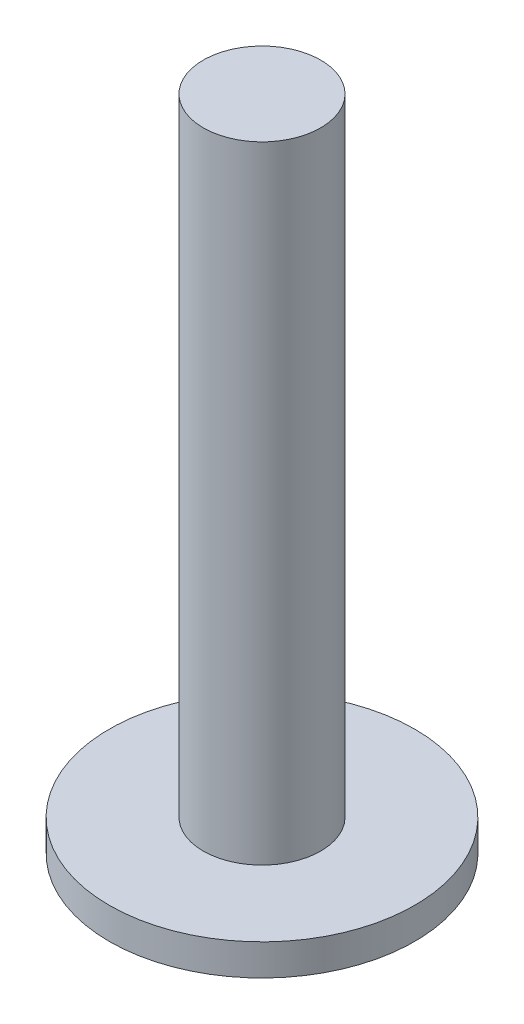
ISO-10303-21;
HEADER;
FILE_DESCRIPTION(('STEP AP214'),'2;1');
FILE_NAME('part.step','',(''),(''),'','','');
FILE_SCHEMA(('AUTOMOTIVE_DESIGN { 1 0 10303 214 1 1 1 1 }'));
ENDSEC;
DATA;
#1=APPLICATION_CONTEXT('core data for automotive mechanical design processes');
#2=APPLICATION_PROTOCOL_DEFINITION('international standard','automotive_design',2000,#1);
#3=PRODUCT_CONTEXT('',#1,'mechanical');
#4=PRODUCT('Part','Part','',(#3));
#5=PRODUCT_RELATED_PRODUCT_CATEGORY('part','',(#4));
#6=PRODUCT_DEFINITION_FORMATION('','',#4);
#7=PRODUCT_DEFINITION_CONTEXT('part definition',#1,'design');
#8=PRODUCT_DEFINITION('design','',#6,#7);
#9=PRODUCT_DEFINITION_SHAPE('','',#8);
#10=(LENGTH_UNIT() NAMED_UNIT(*) SI_UNIT(.MILLI.,.METRE.));
#11=(NAMED_UNIT(*) PLANE_ANGLE_UNIT() SI_UNIT($,.RADIAN.));
#12=(NAMED_UNIT(*) SI_UNIT($,.STERADIAN.) SOLID_ANGLE_UNIT());
#13=UNCERTAINTY_MEASURE_WITH_UNIT(LENGTH_MEASURE(1.E-05),#10,'distance_accuracy_value','');
#14=(GEOMETRIC_REPRESENTATION_CONTEXT(3) GLOBAL_UNCERTAINTY_ASSIGNED_CONTEXT((#13)) GLOBAL_UNIT_ASSIGNED_CONTEXT((#10,
#11,#12)) REPRESENTATION_CONTEXT('',''));
#15=CARTESIAN_POINT('',(0.,0.,0.));
#16=DIRECTION('',(0.,0.,1.));
#17=DIRECTION('',(1.,0.,0.));
#18=AXIS2_PLACEMENT_3D('',#15,#16,#17);
#19=CARTESIAN_POINT('',(0.,0.8,0.));
#20=DIRECTION('',(0.,1.,0.));
#21=DIRECTION('',(0.,0.,1.));
#22=AXIS2_PLACEMENT_3D('',#19,#20,#21);
#23=PLANE('',#22);
#24=CARTESIAN_POINT('',(0.,0.8,0.));
#25=DIRECTION('',(0.,1.,0.));
#26=DIRECTION('',(0.,0.,1.));
#27=AXIS2_PLACEMENT_3D('',#24,#25,#26);
#28=CIRCLE('',#27,1.5);
#29=CARTESIAN_POINT('',(0.,0.8,1.5));
#30=VERTEX_POINT('',#29);
#31=EDGE_CURVE('E232',#30,#30,#28,.T.);
#32=ORIENTED_EDGE('',*,*,#31,.F.);
#33=EDGE_LOOP('',(#32));
#34=FACE_BOUND('',#33,.T.);
#35=CARTESIAN_POINT('',(0.,0.8,0.));
#36=DIRECTION('',(0.,1.,0.));
#37=DIRECTION('',(0.,0.,1.));
#38=AXIS2_PLACEMENT_3D('',#35,#36,#37);
#39=CIRCLE('',#38,3.9);
#40=CARTESIAN_POINT('',(0.,0.8,3.9));
#41=VERTEX_POINT('',#40);
#42=EDGE_CURVE('E11',#41,#41,#39,.T.);
#43=ORIENTED_EDGE('',*,*,#42,.T.);
#44=EDGE_LOOP('',(#43));
#45=FACE_BOUND('',#44,.T.);
#46=ADVANCED_FACE('F41',(#34,#45),#23,.T.);
#47=CARTESIAN_POINT('',(0.,0.,0.));
#48=DIRECTION('',(0.,1.,0.));
#49=DIRECTION('',(0.,0.,1.));
#50=AXIS2_PLACEMENT_3D('',#47,#48,#49);
#51=PLANE('',#50);
#52=CARTESIAN_POINT('',(0.,0.,0.));
#53=DIRECTION('',(0.,1.,0.));
#54=DIRECTION('',(0.,0.,1.));
#55=AXIS2_PLACEMENT_3D('',#52,#53,#54);
#56=CIRCLE('',#55,3.9);
#57=CARTESIAN_POINT('',(0.,0.,3.9));
#58=VERTEX_POINT('',#57);
#59=EDGE_CURVE('E45',#58,#58,#56,.T.);
#60=ORIENTED_EDGE('',*,*,#59,.F.);
#61=EDGE_LOOP('',(#60));
#62=FACE_BOUND('',#61,.T.);
#63=DIRECTION('',(1.,0.,0.));
#64=VECTOR('',#63,1.);
#65=CARTESIAN_POINT('',(-0.2,0.,0.199999999999999));
#66=LINE('',#65,#64);
#67=CARTESIAN_POINT('',(-1.,0.,0.2));
#68=VERTEX_POINT('',#67);
#69=CARTESIAN_POINT('',(-0.2,0.,0.199999999999999));
#70=VERTEX_POINT('',#69);
#71=EDGE_CURVE('E231',#68,#70,#66,.T.);
#72=ORIENTED_EDGE('',*,*,#71,.T.);
#73=DIRECTION('',(0.,0.,1.));
#74=VECTOR('',#73,1.);
#75=CARTESIAN_POINT('',(-0.2,0.,1.));
#76=LINE('',#75,#74);
#77=CARTESIAN_POINT('',(-0.2,0.,1.));
#78=VERTEX_POINT('',#77);
#79=EDGE_CURVE('E234',#70,#78,#76,.T.);
#80=ORIENTED_EDGE('',*,*,#79,.T.);
#81=DIRECTION('',(1.,0.,0.));
#82=VECTOR('',#81,1.);
#83=CARTESIAN_POINT('',(0.2,0.,1.));
#84=LINE('',#83,#82);
#85=CARTESIAN_POINT('',(0.2,0.,1.));
#86=VERTEX_POINT('',#85);
#87=EDGE_CURVE('E269',#78,#86,#84,.T.);
#88=ORIENTED_EDGE('',*,*,#87,.T.);
#89=DIRECTION('',(0.,0.,-1.));
#90=VECTOR('',#89,1.);
#91=CARTESIAN_POINT('',(0.2,0.,0.2));
#92=LINE('',#91,#90);
#93=CARTESIAN_POINT('',(0.2,0.,0.2));
#94=VERTEX_POINT('',#93);
#95=EDGE_CURVE('E272',#86,#94,#92,.T.);
#96=ORIENTED_EDGE('',*,*,#95,.T.);
#97=DIRECTION('',(1.,0.,0.));
#98=VECTOR('',#97,1.);
#99=CARTESIAN_POINT('',(1.,0.,0.2));
#100=LINE('',#99,#98);
#101=CARTESIAN_POINT('',(1.,0.,0.2));
#102=VERTEX_POINT('',#101);
#103=EDGE_CURVE('E275',#94,#102,#100,.T.);
#104=ORIENTED_EDGE('',*,*,#103,.T.);
#105=DIRECTION('',(0.,0.,-1.));
#106=VECTOR('',#105,1.);
#107=CARTESIAN_POINT('',(1.,0.,-0.2));
#108=LINE('',#107,#106);
#109=CARTESIAN_POINT('',(1.,0.,-0.2));
#110=VERTEX_POINT('',#109);
#111=EDGE_CURVE('E278',#102,#110,#108,.T.);
#112=ORIENTED_EDGE('',*,*,#111,.T.);
#113=DIRECTION('',(-1.,0.,0.));
#114=VECTOR('',#113,1.);
#115=CARTESIAN_POINT('',(0.2,0.,-0.2));
#116=LINE('',#115,#114);
#117=CARTESIAN_POINT('',(0.2,0.,-0.2));
#118=VERTEX_POINT('',#117);
#119=EDGE_CURVE('E281',#110,#118,#116,.T.);
#120=ORIENTED_EDGE('',*,*,#119,.T.);
#121=DIRECTION('',(0.,0.,-1.));
#122=VECTOR('',#121,1.);
#123=CARTESIAN_POINT('',(0.2,0.,-1.));
#124=LINE('',#123,#122);
#125=CARTESIAN_POINT('',(0.2,0.,-1.));
#126=VERTEX_POINT('',#125);
#127=EDGE_CURVE('E132',#118,#126,#124,.T.);
#128=ORIENTED_EDGE('',*,*,#127,.T.);
#129=DIRECTION('',(-1.,0.,0.));
#130=VECTOR('',#129,1.);
#131=CARTESIAN_POINT('',(-0.2,0.,-1.));
#132=LINE('',#131,#130);
#133=CARTESIAN_POINT('',(-0.2,0.,-1.));
#134=VERTEX_POINT('',#133);
#135=EDGE_CURVE('E130',#126,#134,#132,.T.);
#136=ORIENTED_EDGE('',*,*,#135,.T.);
#137=DIRECTION('',(0.,0.,1.));
#138=VECTOR('',#137,1.);
#139=CARTESIAN_POINT('',(-0.2,0.,-0.2));
#140=LINE('',#139,#138);
#141=CARTESIAN_POINT('',(-0.2,0.,-0.2));
#142=VERTEX_POINT('',#141);
#143=EDGE_CURVE('E109',#134,#142,#140,.T.);
#144=ORIENTED_EDGE('',*,*,#143,.T.);
#145=DIRECTION('',(-1.,0.,0.));
#146=VECTOR('',#145,1.);
#147=CARTESIAN_POINT('',(-1.,0.,-0.2));
#148=LINE('',#147,#146);
#149=CARTESIAN_POINT('',(-1.,0.,-0.2));
#150=VERTEX_POINT('',#149);
#151=EDGE_CURVE('E120',#142,#150,#148,.T.);
#152=ORIENTED_EDGE('',*,*,#151,.T.);
#153=DIRECTION('',(0.,0.,1.));
#154=VECTOR('',#153,1.);
#155=CARTESIAN_POINT('',(-1.,0.,0.));
#156=LINE('',#155,#154);
#157=EDGE_CURVE('E125',#150,#68,#156,.T.);
#158=ORIENTED_EDGE('',*,*,#157,.T.);
#159=EDGE_LOOP('',(#72,#80,#88,#96,#104,#112,#120,#128,#136,#144,#152,#158));
#160=FACE_BOUND('',#159,.T.);
#161=ADVANCED_FACE('F128',(#62,#160),#51,.F.);
#162=CARTESIAN_POINT('',(0.,0.8,0.));
#163=DIRECTION('',(0.,-1.,0.));
#164=DIRECTION('',(0.,0.,-1.));
#165=AXIS2_PLACEMENT_3D('',#162,#163,#164);
#166=CYLINDRICAL_SURFACE('',#165,3.9);
#167=ORIENTED_EDGE('',*,*,#42,.F.);
#168=EDGE_LOOP('',(#167));
#169=FACE_BOUND('',#168,.T.);
#170=ORIENTED_EDGE('',*,*,#59,.T.);
#171=EDGE_LOOP('',(#170));
#172=FACE_BOUND('',#171,.T.);
#173=ADVANCED_FACE('F43',(#169,#172),#166,.T.);
#174=CARTESIAN_POINT('',(-0.2,0.8,0.199999999999999));
#175=DIRECTION('',(0.,0.,-1.));
#176=DIRECTION('',(-1.,0.,0.));
#177=AXIS2_PLACEMENT_3D('',#174,#175,#176);
#178=PLANE('',#177);
#179=ORIENTED_EDGE('',*,*,#71,.F.);
#180=DIRECTION('',(0.,-1.,0.));
#181=VECTOR('',#180,1.);
#182=CARTESIAN_POINT('',(-1.,0.8,0.2));
#183=LINE('',#182,#181);
#184=CARTESIAN_POINT('',(-1.,0.8,0.2));
#185=VERTEX_POINT('',#184);
#186=EDGE_CURVE('E56',#185,#68,#183,.T.);
#187=ORIENTED_EDGE('',*,*,#186,.F.);
#188=DIRECTION('',(1.,0.,0.));
#189=VECTOR('',#188,1.);
#190=CARTESIAN_POINT('',(-0.2,0.8,0.199999999999999));
#191=LINE('',#190,#189);
#192=CARTESIAN_POINT('',(-0.2,0.8,0.2));
#193=VERTEX_POINT('',#192);
#194=EDGE_CURVE('E65',#185,#193,#191,.T.);
#195=ORIENTED_EDGE('',*,*,#194,.T.);
#196=DIRECTION('',(0.,-1.,0.));
#197=VECTOR('',#196,1.);
#198=CARTESIAN_POINT('',(-0.2,0.8,0.199999999999999));
#199=LINE('',#198,#197);
#200=EDGE_CURVE('E158',#193,#70,#199,.T.);
#201=ORIENTED_EDGE('',*,*,#200,.T.);
#202=EDGE_LOOP('',(#179,#187,#195,#201));
#203=FACE_BOUND('',#202,.T.);
#204=ADVANCED_FACE('F168',(#203),#178,.T.);
#205=CARTESIAN_POINT('',(-0.2,0.8,1.));
#206=DIRECTION('',(1.,0.,0.));
#207=DIRECTION('',(0.,0.,-1.));
#208=AXIS2_PLACEMENT_3D('',#205,#206,#207);
#209=PLANE('',#208);
#210=ORIENTED_EDGE('',*,*,#79,.F.);
#211=ORIENTED_EDGE('',*,*,#200,.F.);
#212=DIRECTION('',(0.,0.,1.));
#213=VECTOR('',#212,1.);
#214=CARTESIAN_POINT('',(-0.2,0.8,1.));
#215=LINE('',#214,#213);
#216=CARTESIAN_POINT('',(-0.2,0.8,1.));
#217=VERTEX_POINT('',#216);
#218=EDGE_CURVE('E241',#193,#217,#215,.T.);
#219=ORIENTED_EDGE('',*,*,#218,.T.);
#220=DIRECTION('',(0.,-1.,0.));
#221=VECTOR('',#220,1.);
#222=CARTESIAN_POINT('',(-0.2,0.8,1.));
#223=LINE('',#222,#221);
#224=EDGE_CURVE('E155',#217,#78,#223,.T.);
#225=ORIENTED_EDGE('',*,*,#224,.T.);
#226=EDGE_LOOP('',(#210,#211,#219,#225));
#227=FACE_BOUND('',#226,.T.);
#228=ADVANCED_FACE('F176',(#227),#209,.T.);
#229=CARTESIAN_POINT('',(0.2,0.8,1.));
#230=DIRECTION('',(0.,0.,-1.));
#231=DIRECTION('',(-1.,0.,0.));
#232=AXIS2_PLACEMENT_3D('',#229,#230,#231);
#233=PLANE('',#232);
#234=ORIENTED_EDGE('',*,*,#87,.F.);
#235=ORIENTED_EDGE('',*,*,#224,.F.);
#236=DIRECTION('',(1.,0.,0.));
#237=VECTOR('',#236,1.);
#238=CARTESIAN_POINT('',(0.,0.8,1.));
#239=LINE('',#238,#237);
#240=CARTESIAN_POINT('',(0.2,0.8,1.));
#241=VERTEX_POINT('',#240);
#242=EDGE_CURVE('E244',#217,#241,#239,.T.);
#243=ORIENTED_EDGE('',*,*,#242,.T.);
#244=DIRECTION('',(0.,-1.,0.));
#245=VECTOR('',#244,1.);
#246=CARTESIAN_POINT('',(0.2,0.8,1.));
#247=LINE('',#246,#245);
#248=EDGE_CURVE('E153',#241,#86,#247,.T.);
#249=ORIENTED_EDGE('',*,*,#248,.T.);
#250=EDGE_LOOP('',(#234,#235,#243,#249));
#251=FACE_BOUND('',#250,.T.);
#252=ADVANCED_FACE('F180',(#251),#233,.T.);
#253=CARTESIAN_POINT('',(0.2,0.8,0.2));
#254=DIRECTION('',(-1.,0.,0.));
#255=DIRECTION('',(0.,0.,1.));
#256=AXIS2_PLACEMENT_3D('',#253,#254,#255);
#257=PLANE('',#256);
#258=ORIENTED_EDGE('',*,*,#95,.F.);
#259=ORIENTED_EDGE('',*,*,#248,.F.);
#260=DIRECTION('',(0.,0.,-1.));
#261=VECTOR('',#260,1.);
#262=CARTESIAN_POINT('',(0.2,0.8,0.2));
#263=LINE('',#262,#261);
#264=CARTESIAN_POINT('',(0.2,0.8,0.2));
#265=VERTEX_POINT('',#264);
#266=EDGE_CURVE('E247',#241,#265,#263,.T.);
#267=ORIENTED_EDGE('',*,*,#266,.T.);
#268=DIRECTION('',(0.,-1.,0.));
#269=VECTOR('',#268,1.);
#270=CARTESIAN_POINT('',(0.2,0.8,0.2));
#271=LINE('',#270,#269);
#272=EDGE_CURVE('E151',#265,#94,#271,.T.);
#273=ORIENTED_EDGE('',*,*,#272,.T.);
#274=EDGE_LOOP('',(#258,#259,#267,#273));
#275=FACE_BOUND('',#274,.T.);
#276=ADVANCED_FACE('F184',(#275),#257,.T.);
#277=CARTESIAN_POINT('',(1.,0.8,0.2));
#278=DIRECTION('',(0.,0.,-1.));
#279=DIRECTION('',(-1.,0.,0.));
#280=AXIS2_PLACEMENT_3D('',#277,#278,#279);
#281=PLANE('',#280);
#282=ORIENTED_EDGE('',*,*,#103,.F.);
#283=ORIENTED_EDGE('',*,*,#272,.F.);
#284=DIRECTION('',(1.,0.,0.));
#285=VECTOR('',#284,1.);
#286=CARTESIAN_POINT('',(1.,0.8,0.2));
#287=LINE('',#286,#285);
#288=CARTESIAN_POINT('',(1.,0.8,0.2));
#289=VERTEX_POINT('',#288);
#290=EDGE_CURVE('E250',#265,#289,#287,.T.);
#291=ORIENTED_EDGE('',*,*,#290,.T.);
#292=DIRECTION('',(0.,-1.,0.));
#293=VECTOR('',#292,1.);
#294=CARTESIAN_POINT('',(1.,0.8,0.2));
#295=LINE('',#294,#293);
#296=EDGE_CURVE('E148',#289,#102,#295,.T.);
#297=ORIENTED_EDGE('',*,*,#296,.T.);
#298=EDGE_LOOP('',(#282,#283,#291,#297));
#299=FACE_BOUND('',#298,.T.);
#300=ADVANCED_FACE('F188',(#299),#281,.T.);
#301=CARTESIAN_POINT('',(1.,0.8,-0.2));
#302=DIRECTION('',(-1.,0.,0.));
#303=DIRECTION('',(0.,0.,1.));
#304=AXIS2_PLACEMENT_3D('',#301,#302,#303);
#305=PLANE('',#304);
#306=ORIENTED_EDGE('',*,*,#111,.F.);
#307=ORIENTED_EDGE('',*,*,#296,.F.);
#308=DIRECTION('',(0.,0.,-1.));
#309=VECTOR('',#308,1.);
#310=CARTESIAN_POINT('',(1.,0.8,0.));
#311=LINE('',#310,#309);
#312=CARTESIAN_POINT('',(1.,0.8,-0.2));
#313=VERTEX_POINT('',#312);
#314=EDGE_CURVE('E253',#289,#313,#311,.T.);
#315=ORIENTED_EDGE('',*,*,#314,.T.);
#316=DIRECTION('',(0.,-1.,0.));
#317=VECTOR('',#316,1.);
#318=CARTESIAN_POINT('',(1.,0.8,-0.2));
#319=LINE('',#318,#317);
#320=EDGE_CURVE('E146',#313,#110,#319,.T.);
#321=ORIENTED_EDGE('',*,*,#320,.T.);
#322=EDGE_LOOP('',(#306,#307,#315,#321));
#323=FACE_BOUND('',#322,.T.);
#324=ADVANCED_FACE('F192',(#323),#305,.T.);
#325=CARTESIAN_POINT('',(0.2,0.8,-0.2));
#326=DIRECTION('',(0.,0.,1.));
#327=DIRECTION('',(1.,0.,0.));
#328=AXIS2_PLACEMENT_3D('',#325,#326,#327);
#329=PLANE('',#328);
#330=ORIENTED_EDGE('',*,*,#119,.F.);
#331=ORIENTED_EDGE('',*,*,#320,.F.);
#332=DIRECTION('',(-1.,0.,0.));
#333=VECTOR('',#332,1.);
#334=CARTESIAN_POINT('',(0.2,0.8,-0.2));
#335=LINE('',#334,#333);
#336=CARTESIAN_POINT('',(0.2,0.8,-0.2));
#337=VERTEX_POINT('',#336);
#338=EDGE_CURVE('E256',#313,#337,#335,.T.);
#339=ORIENTED_EDGE('',*,*,#338,.T.);
#340=DIRECTION('',(0.,-1.,0.));
#341=VECTOR('',#340,1.);
#342=CARTESIAN_POINT('',(0.2,0.8,-0.2));
#343=LINE('',#342,#341);
#344=EDGE_CURVE('E144',#337,#118,#343,.T.);
#345=ORIENTED_EDGE('',*,*,#344,.T.);
#346=EDGE_LOOP('',(#330,#331,#339,#345));
#347=FACE_BOUND('',#346,.T.);
#348=ADVANCED_FACE('F196',(#347),#329,.T.);
#349=CARTESIAN_POINT('',(0.2,0.8,-1.));
#350=DIRECTION('',(-1.,0.,0.));
#351=DIRECTION('',(0.,0.,1.));
#352=AXIS2_PLACEMENT_3D('',#349,#350,#351);
#353=PLANE('',#352);
#354=ORIENTED_EDGE('',*,*,#127,.F.);
#355=ORIENTED_EDGE('',*,*,#344,.F.);
#356=DIRECTION('',(0.,0.,-1.));
#357=VECTOR('',#356,1.);
#358=CARTESIAN_POINT('',(0.2,0.8,-1.));
#359=LINE('',#358,#357);
#360=CARTESIAN_POINT('',(0.2,0.8,-1.));
#361=VERTEX_POINT('',#360);
#362=EDGE_CURVE('E259',#337,#361,#359,.T.);
#363=ORIENTED_EDGE('',*,*,#362,.T.);
#364=DIRECTION('',(0.,-1.,0.));
#365=VECTOR('',#364,1.);
#366=CARTESIAN_POINT('',(0.2,0.8,-1.));
#367=LINE('',#366,#365);
#368=EDGE_CURVE('E141',#361,#126,#367,.T.);
#369=ORIENTED_EDGE('',*,*,#368,.T.);
#370=EDGE_LOOP('',(#354,#355,#363,#369));
#371=FACE_BOUND('',#370,.T.);
#372=ADVANCED_FACE('F200',(#371),#353,.T.);
#373=CARTESIAN_POINT('',(-0.2,0.8,-1.));
#374=DIRECTION('',(0.,0.,1.));
#375=DIRECTION('',(1.,0.,0.));
#376=AXIS2_PLACEMENT_3D('',#373,#374,#375);
#377=PLANE('',#376);
#378=ORIENTED_EDGE('',*,*,#135,.F.);
#379=ORIENTED_EDGE('',*,*,#368,.F.);
#380=DIRECTION('',(-1.,0.,0.));
#381=VECTOR('',#380,1.);
#382=CARTESIAN_POINT('',(0.,0.8,-1.));
#383=LINE('',#382,#381);
#384=CARTESIAN_POINT('',(-0.2,0.8,-1.));
#385=VERTEX_POINT('',#384);
#386=EDGE_CURVE('E262',#361,#385,#383,.T.);
#387=ORIENTED_EDGE('',*,*,#386,.T.);
#388=DIRECTION('',(0.,-1.,0.));
#389=VECTOR('',#388,1.);
#390=CARTESIAN_POINT('',(-0.2,0.8,-1.));
#391=LINE('',#390,#389);
#392=EDGE_CURVE('E116',#385,#134,#391,.T.);
#393=ORIENTED_EDGE('',*,*,#392,.T.);
#394=EDGE_LOOP('',(#378,#379,#387,#393));
#395=FACE_BOUND('',#394,.T.);
#396=ADVANCED_FACE('F204',(#395),#377,.T.);
#397=CARTESIAN_POINT('',(-0.2,0.8,-0.2));
#398=DIRECTION('',(1.,0.,0.));
#399=DIRECTION('',(0.,0.,-1.));
#400=AXIS2_PLACEMENT_3D('',#397,#398,#399);
#401=PLANE('',#400);
#402=ORIENTED_EDGE('',*,*,#143,.F.);
#403=ORIENTED_EDGE('',*,*,#392,.F.);
#404=DIRECTION('',(0.,0.,1.));
#405=VECTOR('',#404,1.);
#406=CARTESIAN_POINT('',(-0.2,0.8,-0.2));
#407=LINE('',#406,#405);
#408=CARTESIAN_POINT('',(-0.2,0.8,-0.2));
#409=VERTEX_POINT('',#408);
#410=EDGE_CURVE('E113',#385,#409,#407,.T.);
#411=ORIENTED_EDGE('',*,*,#410,.T.);
#412=DIRECTION('',(0.,-1.,0.));
#413=VECTOR('',#412,1.);
#414=CARTESIAN_POINT('',(-0.2,0.8,-0.2));
#415=LINE('',#414,#413);
#416=EDGE_CURVE('E104',#409,#142,#415,.T.);
#417=ORIENTED_EDGE('',*,*,#416,.T.);
#418=EDGE_LOOP('',(#402,#403,#411,#417));
#419=FACE_BOUND('',#418,.T.);
#420=ADVANCED_FACE('F106',(#419),#401,.T.);
#421=CARTESIAN_POINT('',(-1.,0.8,-0.2));
#422=DIRECTION('',(0.,0.,1.));
#423=DIRECTION('',(1.,0.,0.));
#424=AXIS2_PLACEMENT_3D('',#421,#422,#423);
#425=PLANE('',#424);
#426=ORIENTED_EDGE('',*,*,#151,.F.);
#427=ORIENTED_EDGE('',*,*,#416,.F.);
#428=DIRECTION('',(-1.,0.,0.));
#429=VECTOR('',#428,1.);
#430=CARTESIAN_POINT('',(-1.,0.8,-0.2));
#431=LINE('',#430,#429);
#432=CARTESIAN_POINT('',(-1.,0.8,-0.2));
#433=VERTEX_POINT('',#432);
#434=EDGE_CURVE('E138',#409,#433,#431,.T.);
#435=ORIENTED_EDGE('',*,*,#434,.T.);
#436=DIRECTION('',(0.,-1.,0.));
#437=VECTOR('',#436,1.);
#438=CARTESIAN_POINT('',(-1.,0.8,-0.2));
#439=LINE('',#438,#437);
#440=EDGE_CURVE('E117',#433,#150,#439,.T.);
#441=ORIENTED_EDGE('',*,*,#440,.T.);
#442=EDGE_LOOP('',(#426,#427,#435,#441));
#443=FACE_BOUND('',#442,.T.);
#444=ADVANCED_FACE('F121',(#443),#425,.T.);
#445=CARTESIAN_POINT('',(-1.,0.8,0.));
#446=DIRECTION('',(1.,0.,0.));
#447=DIRECTION('',(0.,0.,-1.));
#448=AXIS2_PLACEMENT_3D('',#445,#446,#447);
#449=PLANE('',#448);
#450=ORIENTED_EDGE('',*,*,#157,.F.);
#451=ORIENTED_EDGE('',*,*,#440,.F.);
#452=DIRECTION('',(0.,0.,1.));
#453=VECTOR('',#452,1.);
#454=CARTESIAN_POINT('',(-1.,0.8,0.2));
#455=LINE('',#454,#453);
#456=EDGE_CURVE('E137',#433,#185,#455,.T.);
#457=ORIENTED_EDGE('',*,*,#456,.T.);
#458=ORIENTED_EDGE('',*,*,#186,.T.);
#459=EDGE_LOOP('',(#450,#451,#457,#458));
#460=FACE_BOUND('',#459,.T.);
#461=ADVANCED_FACE('F213',(#460),#449,.T.);
#462=CARTESIAN_POINT('',(0.,0.8,0.));
#463=DIRECTION('',(0.,1.,0.));
#464=DIRECTION('',(0.,0.,1.));
#465=AXIS2_PLACEMENT_3D('',#462,#463,#464);
#466=PLANE('',#465);
#467=ORIENTED_EDGE('',*,*,#194,.F.);
#468=ORIENTED_EDGE('',*,*,#456,.F.);
#469=ORIENTED_EDGE('',*,*,#434,.F.);
#470=ORIENTED_EDGE('',*,*,#410,.F.);
#471=ORIENTED_EDGE('',*,*,#386,.F.);
#472=ORIENTED_EDGE('',*,*,#362,.F.);
#473=ORIENTED_EDGE('',*,*,#338,.F.);
#474=ORIENTED_EDGE('',*,*,#314,.F.);
#475=ORIENTED_EDGE('',*,*,#290,.F.);
#476=ORIENTED_EDGE('',*,*,#266,.F.);
#477=ORIENTED_EDGE('',*,*,#242,.F.);
#478=ORIENTED_EDGE('',*,*,#218,.F.);
#479=EDGE_LOOP('',(#467,#468,#469,#470,#471,#472,#473,#474,#475,#476,#477,#478));
#480=FACE_BOUND('',#479,.T.);
#481=ADVANCED_FACE('F216',(#480),#466,.F.);
#482=CARTESIAN_POINT('',(0.,16.8,0.));
#483=DIRECTION('',(0.,-1.,0.));
#484=DIRECTION('',(0.,0.,-1.));
#485=AXIS2_PLACEMENT_3D('',#482,#483,#484);
#486=CYLINDRICAL_SURFACE('',#485,1.5);
#487=CARTESIAN_POINT('',(0.,16.8,0.));
#488=DIRECTION('',(0.,1.,0.));
#489=DIRECTION('',(0.,0.,1.));
#490=AXIS2_PLACEMENT_3D('',#487,#488,#489);
#491=CIRCLE('',#490,1.5);
#492=CARTESIAN_POINT('',(0.,16.8,1.5));
#493=VERTEX_POINT('',#492);
#494=EDGE_CURVE('E230',#493,#493,#491,.T.);
#495=ORIENTED_EDGE('',*,*,#494,.F.);
#496=EDGE_LOOP('',(#495));
#497=FACE_BOUND('',#496,.T.);
#498=ORIENTED_EDGE('',*,*,#31,.T.);
#499=EDGE_LOOP('',(#498));
#500=FACE_BOUND('',#499,.T.);
#501=ADVANCED_FACE('F217',(#497,#500),#486,.T.);
#502=CARTESIAN_POINT('',(0.,16.8,0.));
#503=DIRECTION('',(0.,1.,0.));
#504=DIRECTION('',(0.,0.,1.));
#505=AXIS2_PLACEMENT_3D('',#502,#503,#504);
#506=PLANE('',#505);
#507=ORIENTED_EDGE('',*,*,#494,.T.);
#508=EDGE_LOOP('',(#507));
#509=FACE_BOUND('',#508,.T.);
#510=ADVANCED_FACE('F220',(#509),#506,.T.);
#511=CLOSED_SHELL('',(#46,#161,#173,#204,#228,#252,#276,#300,#324,#348,#372,#396,#420,#444,#461,
#481,#501,#510));
#512=MANIFOLD_SOLID_BREP('B2',#511);
#513=ADVANCED_BREP_SHAPE_REPRESENTATION('',(#18,#512),#14);
#514=SHAPE_DEFINITION_REPRESENTATION(#9,#513);
ENDSEC;
END-ISO-10303-21;
